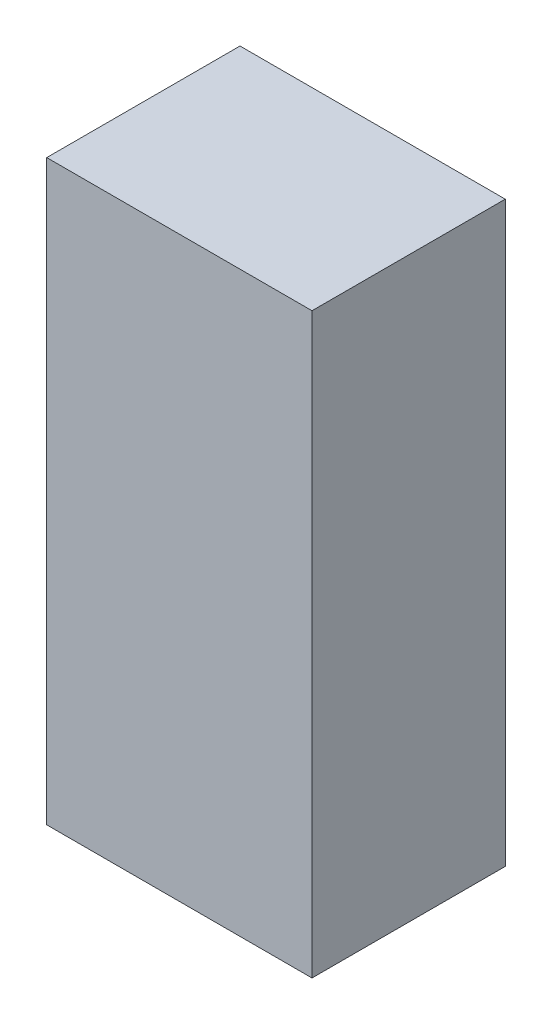
ISO-10303-21;
HEADER;
FILE_DESCRIPTION(('STEP AP214'),'2;1');
FILE_NAME('part.step','',(''),(''),'','','');
FILE_SCHEMA(('AUTOMOTIVE_DESIGN { 1 0 10303 214 1 1 1 1 }'));
ENDSEC;
DATA;
#1=APPLICATION_CONTEXT('core data for automotive mechanical design processes');
#2=APPLICATION_PROTOCOL_DEFINITION('international standard','automotive_design',2000,#1);
#3=PRODUCT_CONTEXT('',#1,'mechanical');
#4=PRODUCT('Part','Part','',(#3));
#5=PRODUCT_RELATED_PRODUCT_CATEGORY('part','',(#4));
#6=PRODUCT_DEFINITION_FORMATION('','',#4);
#7=PRODUCT_DEFINITION_CONTEXT('part definition',#1,'design');
#8=PRODUCT_DEFINITION('design','',#6,#7);
#9=PRODUCT_DEFINITION_SHAPE('','',#8);
#10=(LENGTH_UNIT() NAMED_UNIT(*) SI_UNIT(.MILLI.,.METRE.));
#11=(NAMED_UNIT(*) PLANE_ANGLE_UNIT() SI_UNIT($,.RADIAN.));
#12=(NAMED_UNIT(*) SI_UNIT($,.STERADIAN.) SOLID_ANGLE_UNIT());
#13=UNCERTAINTY_MEASURE_WITH_UNIT(LENGTH_MEASURE(1.E-05),#10,'distance_accuracy_value','');
#14=(GEOMETRIC_REPRESENTATION_CONTEXT(3) GLOBAL_UNCERTAINTY_ASSIGNED_CONTEXT((#13)) GLOBAL_UNIT_ASSIGNED_CONTEXT((#10,
#11,#12)) REPRESENTATION_CONTEXT('',''));
#15=CARTESIAN_POINT('',(0.,0.,0.));
#16=DIRECTION('',(0.,0.,1.));
#17=DIRECTION('',(1.,0.,0.));
#18=AXIS2_PLACEMENT_3D('',#15,#16,#17);
#19=CARTESIAN_POINT('',(0.70000114,1.52500076,1.0200005));
#20=DIRECTION('',(0.,0.,1.));
#21=DIRECTION('',(1.,0.,0.));
#22=AXIS2_PLACEMENT_3D('',#19,#20,#21);
#23=PLANE('',#22);
#24=DIRECTION('',(1.,0.,0.));
#25=VECTOR('',#24,1.);
#26=CARTESIAN_POINT('',(0.70000114,-1.52499822,1.0200005));
#27=LINE('',#26,#25);
#28=CARTESIAN_POINT('',(0.70000114,-1.52499822,1.0200005));
#29=VERTEX_POINT('',#28);
#30=CARTESIAN_POINT('',(-0.6999986,-1.52499822,1.0200005));
#31=VERTEX_POINT('',#30);
#32=EDGE_CURVE('E52',#29,#31,#27,.F.);
#33=ORIENTED_EDGE('',*,*,#32,.F.);
#34=DIRECTION('',(0.,1.,0.));
#35=VECTOR('',#34,1.);
#36=CARTESIAN_POINT('',(0.70000114,1.52500076,1.0200005));
#37=LINE('',#36,#35);
#38=CARTESIAN_POINT('',(0.70000114,1.52500076,1.0200005));
#39=VERTEX_POINT('',#38);
#40=EDGE_CURVE('E67',#39,#29,#37,.F.);
#41=ORIENTED_EDGE('',*,*,#40,.F.);
#42=DIRECTION('',(1.,0.,0.));
#43=VECTOR('',#42,1.);
#44=CARTESIAN_POINT('',(-0.6999986,1.52500076,1.0200005));
#45=LINE('',#44,#43);
#46=CARTESIAN_POINT('',(-0.6999986,1.52500076,1.0200005));
#47=VERTEX_POINT('',#46);
#48=EDGE_CURVE('E19',#47,#39,#45,.T.);
#49=ORIENTED_EDGE('',*,*,#48,.F.);
#50=DIRECTION('',(0.,1.,0.));
#51=VECTOR('',#50,1.);
#52=CARTESIAN_POINT('',(-0.6999986,-1.52499822,1.0200005));
#53=LINE('',#52,#51);
#54=EDGE_CURVE('E57',#31,#47,#53,.T.);
#55=ORIENTED_EDGE('',*,*,#54,.F.);
#56=EDGE_LOOP('',(#33,#41,#49,#55));
#57=FACE_BOUND('',#56,.T.);
#58=ADVANCED_FACE('F16',(#57),#23,.T.);
#59=CARTESIAN_POINT('',(-0.6999986,1.52500076,0.));
#60=DIRECTION('',(0.,1.,0.));
#61=DIRECTION('',(0.,0.,1.));
#62=AXIS2_PLACEMENT_3D('',#59,#60,#61);
#63=PLANE('',#62);
#64=DIRECTION('',(0.,0.,-1.));
#65=VECTOR('',#64,1.);
#66=CARTESIAN_POINT('',(0.70000114,1.52500076,0.));
#67=LINE('',#66,#65);
#68=CARTESIAN_POINT('',(0.70000114,1.52500076,0.));
#69=VERTEX_POINT('',#68);
#70=EDGE_CURVE('E78',#69,#39,#67,.F.);
#71=ORIENTED_EDGE('',*,*,#70,.F.);
#72=DIRECTION('',(1.,0.,0.));
#73=VECTOR('',#72,1.);
#74=CARTESIAN_POINT('',(0.70000114,1.52500076,0.));
#75=LINE('',#74,#73);
#76=CARTESIAN_POINT('',(-0.6999986,1.52500076,0.));
#77=VERTEX_POINT('',#76);
#78=EDGE_CURVE('E73',#69,#77,#75,.F.);
#79=ORIENTED_EDGE('',*,*,#78,.T.);
#80=DIRECTION('',(0.,0.,1.));
#81=VECTOR('',#80,1.);
#82=CARTESIAN_POINT('',(-0.6999986,1.52500076,0.));
#83=LINE('',#82,#81);
#84=EDGE_CURVE('E62',#47,#77,#83,.F.);
#85=ORIENTED_EDGE('',*,*,#84,.F.);
#86=ORIENTED_EDGE('',*,*,#48,.T.);
#87=EDGE_LOOP('',(#71,#79,#85,#86));
#88=FACE_BOUND('',#87,.T.);
#89=ADVANCED_FACE('F72',(#88),#63,.T.);
#90=CARTESIAN_POINT('',(-0.6999986,-1.52499822,0.));
#91=DIRECTION('',(-1.,0.,0.));
#92=DIRECTION('',(0.,0.,1.));
#93=AXIS2_PLACEMENT_3D('',#90,#91,#92);
#94=PLANE('',#93);
#95=ORIENTED_EDGE('',*,*,#84,.T.);
#96=DIRECTION('',(0.,1.,0.));
#97=VECTOR('',#96,1.);
#98=CARTESIAN_POINT('',(-0.6999986,1.52500076,0.));
#99=LINE('',#98,#97);
#100=CARTESIAN_POINT('',(-0.6999986,-1.52499822,0.));
#101=VERTEX_POINT('',#100);
#102=EDGE_CURVE('E83',#77,#101,#99,.F.);
#103=ORIENTED_EDGE('',*,*,#102,.T.);
#104=DIRECTION('',(0.,0.,-1.));
#105=VECTOR('',#104,1.);
#106=CARTESIAN_POINT('',(-0.6999986,-1.52499822,0.));
#107=LINE('',#106,#105);
#108=EDGE_CURVE('E64',#31,#101,#107,.T.);
#109=ORIENTED_EDGE('',*,*,#108,.F.);
#110=ORIENTED_EDGE('',*,*,#54,.T.);
#111=EDGE_LOOP('',(#95,#103,#109,#110));
#112=FACE_BOUND('',#111,.T.);
#113=ADVANCED_FACE('F59',(#112),#94,.T.);
#114=CARTESIAN_POINT('',(0.70000114,-1.52499822,0.));
#115=DIRECTION('',(0.,-1.,0.));
#116=DIRECTION('',(0.,0.,-1.));
#117=AXIS2_PLACEMENT_3D('',#114,#115,#116);
#118=PLANE('',#117);
#119=ORIENTED_EDGE('',*,*,#108,.T.);
#120=DIRECTION('',(1.,0.,0.));
#121=VECTOR('',#120,1.);
#122=CARTESIAN_POINT('',(0.70000114,-1.52499822,0.));
#123=LINE('',#122,#121);
#124=CARTESIAN_POINT('',(0.70000114,-1.52499822,0.));
#125=VERTEX_POINT('',#124);
#126=EDGE_CURVE('E25',#101,#125,#123,.T.);
#127=ORIENTED_EDGE('',*,*,#126,.T.);
#128=DIRECTION('',(0.,0.,-1.));
#129=VECTOR('',#128,1.);
#130=CARTESIAN_POINT('',(0.70000114,-1.52499822,0.));
#131=LINE('',#130,#129);
#132=EDGE_CURVE('E33',#29,#125,#131,.T.);
#133=ORIENTED_EDGE('',*,*,#132,.F.);
#134=ORIENTED_EDGE('',*,*,#32,.T.);
#135=EDGE_LOOP('',(#119,#127,#133,#134));
#136=FACE_BOUND('',#135,.T.);
#137=ADVANCED_FACE('F87',(#136),#118,.T.);
#138=CARTESIAN_POINT('',(0.70000114,1.52500076,0.));
#139=DIRECTION('',(1.,0.,0.));
#140=DIRECTION('',(0.,0.,-1.));
#141=AXIS2_PLACEMENT_3D('',#138,#139,#140);
#142=PLANE('',#141);
#143=ORIENTED_EDGE('',*,*,#132,.T.);
#144=DIRECTION('',(0.,1.,0.));
#145=VECTOR('',#144,1.);
#146=CARTESIAN_POINT('',(0.70000114,1.52500076,0.));
#147=LINE('',#146,#145);
#148=EDGE_CURVE('E11',#125,#69,#147,.T.);
#149=ORIENTED_EDGE('',*,*,#148,.T.);
#150=ORIENTED_EDGE('',*,*,#70,.T.);
#151=ORIENTED_EDGE('',*,*,#40,.T.);
#152=EDGE_LOOP('',(#143,#149,#150,#151));
#153=FACE_BOUND('',#152,.T.);
#154=ADVANCED_FACE('F90',(#153),#142,.T.);
#155=CARTESIAN_POINT('',(0.70000114,1.52500076,0.));
#156=DIRECTION('',(0.,0.,1.));
#157=DIRECTION('',(1.,0.,0.));
#158=AXIS2_PLACEMENT_3D('',#155,#156,#157);
#159=PLANE('',#158);
#160=ORIENTED_EDGE('',*,*,#126,.F.);
#161=ORIENTED_EDGE('',*,*,#102,.F.);
#162=ORIENTED_EDGE('',*,*,#78,.F.);
#163=ORIENTED_EDGE('',*,*,#148,.F.);
#164=EDGE_LOOP('',(#160,#161,#162,#163));
#165=FACE_BOUND('',#164,.T.);
#166=ADVANCED_FACE('F89',(#165),#159,.F.);
#167=CLOSED_SHELL('',(#58,#89,#113,#137,#154,#166));
#168=MANIFOLD_SOLID_BREP('B1',#167);
#169=ADVANCED_BREP_SHAPE_REPRESENTATION('',(#18,#168),#14);
#170=SHAPE_DEFINITION_REPRESENTATION(#9,#169);
ENDSEC;
END-ISO-10303-21;
